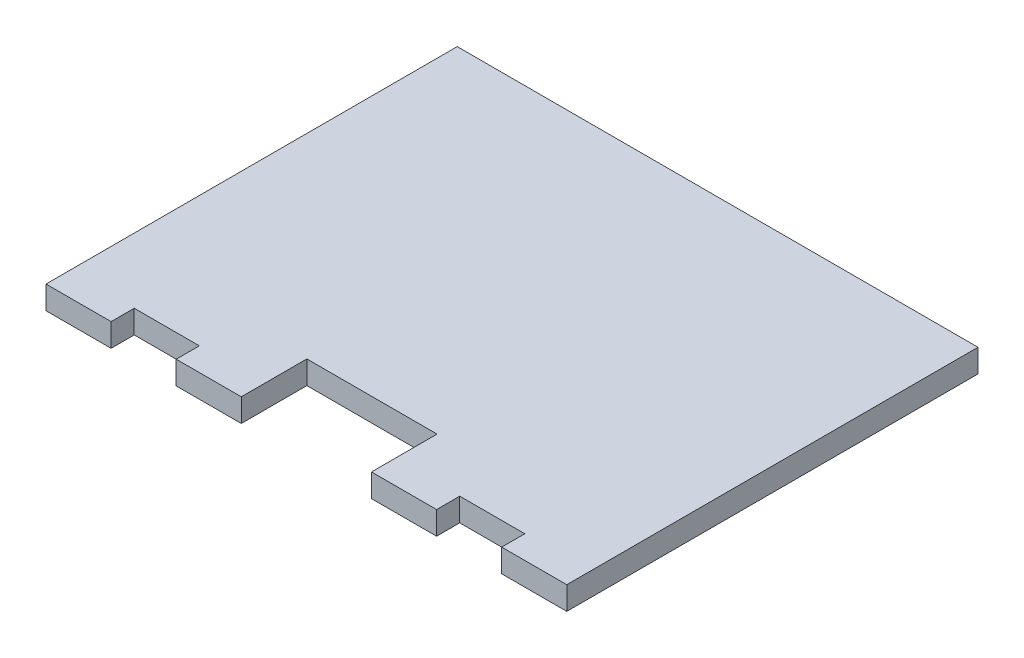
ISO-10303-21;
HEADER;
FILE_DESCRIPTION(('STEP AP214'),'2;1');
FILE_NAME('part.step','',(''),(''),'','','');
FILE_SCHEMA(('AUTOMOTIVE_DESIGN { 1 0 10303 214 1 1 1 1 }'));
ENDSEC;
DATA;
#1=APPLICATION_CONTEXT('core data for automotive mechanical design processes');
#2=APPLICATION_PROTOCOL_DEFINITION('international standard','automotive_design',2000,#1);
#3=PRODUCT_CONTEXT('',#1,'mechanical');
#4=PRODUCT('Part','Part','',(#3));
#5=PRODUCT_RELATED_PRODUCT_CATEGORY('part','',(#4));
#6=PRODUCT_DEFINITION_FORMATION('','',#4);
#7=PRODUCT_DEFINITION_CONTEXT('part definition',#1,'design');
#8=PRODUCT_DEFINITION('design','',#6,#7);
#9=PRODUCT_DEFINITION_SHAPE('','',#8);
#10=(LENGTH_UNIT() NAMED_UNIT(*) SI_UNIT(.MILLI.,.METRE.));
#11=(NAMED_UNIT(*) PLANE_ANGLE_UNIT() SI_UNIT($,.RADIAN.));
#12=(NAMED_UNIT(*) SI_UNIT($,.STERADIAN.) SOLID_ANGLE_UNIT());
#13=UNCERTAINTY_MEASURE_WITH_UNIT(LENGTH_MEASURE(1.E-05),#10,'distance_accuracy_value','');
#14=(GEOMETRIC_REPRESENTATION_CONTEXT(3) GLOBAL_UNCERTAINTY_ASSIGNED_CONTEXT((#13)) GLOBAL_UNIT_ASSIGNED_CONTEXT((#10,
#11,#12)) REPRESENTATION_CONTEXT('',''));
#15=CARTESIAN_POINT('',(0.,0.,0.));
#16=DIRECTION('',(0.,0.,1.));
#17=DIRECTION('',(1.,0.,0.));
#18=AXIS2_PLACEMENT_3D('',#15,#16,#17);
#19=CARTESIAN_POINT('',(-157.972676525822,11.43,159.925244882629));
#20=DIRECTION('',(0.,0.,-1.));
#21=DIRECTION('',(-1.,0.,0.));
#22=AXIS2_PLACEMENT_3D('',#19,#20,#21);
#23=PLANE('',#22);
#24=DIRECTION('',(0.,-1.,0.));
#25=VECTOR('',#24,1.);
#26=CARTESIAN_POINT('',(-93.6757515258217,11.43,159.925244882629));
#27=LINE('',#26,#25);
#28=CARTESIAN_POINT('',(-93.6757515258217,11.43,159.925244882629));
#29=VERTEX_POINT('',#28);
#30=CARTESIAN_POINT('',(-93.6757515258217,0.,159.925244882629));
#31=VERTEX_POINT('',#30);
#32=EDGE_CURVE('E146',#29,#31,#27,.T.);
#33=ORIENTED_EDGE('',*,*,#32,.T.);
#34=DIRECTION('',(1.,0.,0.));
#35=VECTOR('',#34,1.);
#36=CARTESIAN_POINT('',(-157.972676525822,0.,159.925244882629));
#37=LINE('',#36,#35);
#38=CARTESIAN_POINT('',(-61.5272890258217,0.,159.925244882629));
#39=VERTEX_POINT('',#38);
#40=EDGE_CURVE('E195',#31,#39,#37,.T.);
#41=ORIENTED_EDGE('',*,*,#40,.T.);
#42=DIRECTION('',(0.,-1.,0.));
#43=VECTOR('',#42,1.);
#44=CARTESIAN_POINT('',(-61.5272890258217,11.43,159.925244882629));
#45=LINE('',#44,#43);
#46=CARTESIAN_POINT('',(-61.5272890258217,11.43,159.925244882629));
#47=VERTEX_POINT('',#46);
#48=EDGE_CURVE('E55',#47,#39,#45,.T.);
#49=ORIENTED_EDGE('',*,*,#48,.F.);
#50=DIRECTION('',(1.,0.,0.));
#51=VECTOR('',#50,1.);
#52=CARTESIAN_POINT('',(-157.972676525822,11.43,159.925244882629));
#53=LINE('',#52,#51);
#54=EDGE_CURVE('E165',#29,#47,#53,.T.);
#55=ORIENTED_EDGE('',*,*,#54,.F.);
#56=EDGE_LOOP('',(#33,#41,#49,#55));
#57=FACE_BOUND('',#56,.T.);
#58=ADVANCED_FACE('F32',(#57),#23,.F.);
#59=DIRECTION('',(0.,-1.,0.));
#60=VECTOR('',#59,1.);
#61=CARTESIAN_POINT('',(2.76963597417831,11.43,159.925244882629));
#62=LINE('',#61,#60);
#63=CARTESIAN_POINT('',(2.76963597417831,11.43,159.925244882629));
#64=VERTEX_POINT('',#63);
#65=CARTESIAN_POINT('',(2.76963597417831,0.,159.925244882629));
#66=VERTEX_POINT('',#65);
#67=EDGE_CURVE('E260',#64,#66,#62,.T.);
#68=ORIENTED_EDGE('',*,*,#67,.T.);
#69=CARTESIAN_POINT('',(34.9180984741783,0.,159.925244882629));
#70=VERTEX_POINT('',#69);
#71=EDGE_CURVE('E363',#66,#70,#37,.T.);
#72=ORIENTED_EDGE('',*,*,#71,.T.);
#73=DIRECTION('',(0.,-1.,0.));
#74=VECTOR('',#73,1.);
#75=CARTESIAN_POINT('',(34.9180984741783,11.43,159.925244882629));
#76=LINE('',#75,#74);
#77=CARTESIAN_POINT('',(34.9180984741783,11.43,159.925244882629));
#78=VERTEX_POINT('',#77);
#79=EDGE_CURVE('E47',#78,#70,#76,.T.);
#80=ORIENTED_EDGE('',*,*,#79,.F.);
#81=EDGE_CURVE('E172',#64,#78,#53,.T.);
#82=ORIENTED_EDGE('',*,*,#81,.F.);
#83=EDGE_LOOP('',(#68,#72,#80,#82));
#84=FACE_BOUND('',#83,.T.);
#85=ADVANCED_FACE('F305',(#84),#23,.F.);
#86=DIRECTION('',(0.,-1.,0.));
#87=VECTOR('',#86,1.);
#88=CARTESIAN_POINT('',(67.0665609741783,11.43,159.925244882629));
#89=LINE('',#88,#87);
#90=CARTESIAN_POINT('',(67.0665609741783,11.43,159.925244882629));
#91=VERTEX_POINT('',#90);
#92=CARTESIAN_POINT('',(67.0665609741783,0.,159.925244882629));
#93=VERTEX_POINT('',#92);
#94=EDGE_CURVE('E231',#91,#93,#89,.T.);
#95=ORIENTED_EDGE('',*,*,#94,.T.);
#96=CARTESIAN_POINT('',(99.2150234741784,0.,159.925244882629));
#97=VERTEX_POINT('',#96);
#98=EDGE_CURVE('E189',#93,#97,#37,.T.);
#99=ORIENTED_EDGE('',*,*,#98,.T.);
#100=DIRECTION('',(0.,-1.,0.));
#101=VECTOR('',#100,1.);
#102=CARTESIAN_POINT('',(99.2150234741784,11.43,159.925244882629));
#103=LINE('',#102,#101);
#104=CARTESIAN_POINT('',(99.2150234741784,11.43,159.925244882629));
#105=VERTEX_POINT('',#104);
#106=EDGE_CURVE('E40',#105,#97,#103,.T.);
#107=ORIENTED_EDGE('',*,*,#106,.F.);
#108=EDGE_CURVE('E176',#91,#105,#53,.T.);
#109=ORIENTED_EDGE('',*,*,#108,.F.);
#110=EDGE_LOOP('',(#95,#99,#107,#109));
#111=FACE_BOUND('',#110,.T.);
#112=ADVANCED_FACE('F230',(#111),#23,.F.);
#113=CARTESIAN_POINT('',(0.,11.43,0.));
#114=DIRECTION('',(0.,1.,0.));
#115=DIRECTION('',(0.,0.,1.));
#116=AXIS2_PLACEMENT_3D('',#113,#114,#115);
#117=PLANE('',#116);
#118=DIRECTION('',(1.,0.,0.));
#119=VECTOR('',#118,1.);
#120=CARTESIAN_POINT('',(0.,11.43,148.495244882629));
#121=LINE('',#120,#119);
#122=CARTESIAN_POINT('',(-125.824214025822,11.43,148.495244882629));
#123=VERTEX_POINT('',#122);
#124=CARTESIAN_POINT('',(-93.6757515258217,11.43,148.495244882629));
#125=VERTEX_POINT('',#124);
#126=EDGE_CURVE('E158',#123,#125,#121,.T.);
#127=ORIENTED_EDGE('',*,*,#126,.T.);
#128=DIRECTION('',(0.,0.,-1.));
#129=VECTOR('',#128,1.);
#130=CARTESIAN_POINT('',(-93.6757515258217,11.43,0.));
#131=LINE('',#130,#129);
#132=EDGE_CURVE('E149',#29,#125,#131,.T.);
#133=ORIENTED_EDGE('',*,*,#132,.F.);
#134=ORIENTED_EDGE('',*,*,#54,.T.);
#135=DIRECTION('',(0.,0.,-1.));
#136=VECTOR('',#135,1.);
#137=CARTESIAN_POINT('',(-61.5272890258217,11.43,0.));
#138=LINE('',#137,#136);
#139=CARTESIAN_POINT('',(-61.5272890258217,11.43,127.540244882629));
#140=VERTEX_POINT('',#139);
#141=EDGE_CURVE('E266',#47,#140,#138,.T.);
#142=ORIENTED_EDGE('',*,*,#141,.T.);
#143=DIRECTION('',(-1.,0.,0.));
#144=VECTOR('',#143,1.);
#145=CARTESIAN_POINT('',(0.,11.43,127.540244882629));
#146=LINE('',#145,#144);
#147=CARTESIAN_POINT('',(2.76963597417831,11.43,127.540244882629));
#148=VERTEX_POINT('',#147);
#149=EDGE_CURVE('E272',#148,#140,#146,.T.);
#150=ORIENTED_EDGE('',*,*,#149,.F.);
#151=DIRECTION('',(0.,0.,-1.));
#152=VECTOR('',#151,1.);
#153=CARTESIAN_POINT('',(2.76963597417831,11.43,0.));
#154=LINE('',#153,#152);
#155=EDGE_CURVE('E256',#64,#148,#154,.T.);
#156=ORIENTED_EDGE('',*,*,#155,.F.);
#157=ORIENTED_EDGE('',*,*,#81,.T.);
#158=DIRECTION('',(0.,0.,-1.));
#159=VECTOR('',#158,1.);
#160=CARTESIAN_POINT('',(34.9180984741783,11.43,0.));
#161=LINE('',#160,#159);
#162=CARTESIAN_POINT('',(34.9180984741783,11.43,148.495244882629));
#163=VERTEX_POINT('',#162);
#164=EDGE_CURVE('E236',#78,#163,#161,.T.);
#165=ORIENTED_EDGE('',*,*,#164,.T.);
#166=DIRECTION('',(-1.,0.,0.));
#167=VECTOR('',#166,1.);
#168=CARTESIAN_POINT('',(0.,11.43,148.495244882629));
#169=LINE('',#168,#167);
#170=CARTESIAN_POINT('',(67.0665609741783,11.43,148.495244882629));
#171=VERTEX_POINT('',#170);
#172=EDGE_CURVE('E233',#171,#163,#169,.T.);
#173=ORIENTED_EDGE('',*,*,#172,.F.);
#174=DIRECTION('',(0.,0.,-1.));
#175=VECTOR('',#174,1.);
#176=CARTESIAN_POINT('',(67.0665609741787,11.43,1.62858355590464E-13));
#177=LINE('',#176,#175);
#178=EDGE_CURVE('E228',#91,#171,#177,.T.);
#179=ORIENTED_EDGE('',*,*,#178,.F.);
#180=ORIENTED_EDGE('',*,*,#108,.T.);
#181=DIRECTION('',(0.,0.,-1.));
#182=VECTOR('',#181,1.);
#183=CARTESIAN_POINT('',(99.2150234741784,11.43,-43.1680751173709));
#184=LINE('',#183,#182);
#185=CARTESIAN_POINT('',(99.2150234741784,11.43,-43.1680751173709));
#186=VERTEX_POINT('',#185);
#187=EDGE_CURVE('E175',#105,#186,#184,.T.);
#188=ORIENTED_EDGE('',*,*,#187,.T.);
#189=DIRECTION('',(-1.,0.,0.));
#190=VECTOR('',#189,1.);
#191=CARTESIAN_POINT('',(-157.972676525822,11.43,-43.1680751173709));
#192=LINE('',#191,#190);
#193=CARTESIAN_POINT('',(-157.972676525822,11.43,-43.1680751173709));
#194=VERTEX_POINT('',#193);
#195=EDGE_CURVE('E183',#186,#194,#192,.T.);
#196=ORIENTED_EDGE('',*,*,#195,.T.);
#197=DIRECTION('',(0.,0.,1.));
#198=VECTOR('',#197,1.);
#199=CARTESIAN_POINT('',(-157.972676525822,11.43,-43.1680751173709));
#200=LINE('',#199,#198);
#201=CARTESIAN_POINT('',(-157.972676525822,11.43,159.925244882629));
#202=VERTEX_POINT('',#201);
#203=EDGE_CURVE('E180',#194,#202,#200,.T.);
#204=ORIENTED_EDGE('',*,*,#203,.T.);
#205=CARTESIAN_POINT('',(-125.824214025822,11.43,159.925244882629));
#206=VERTEX_POINT('',#205);
#207=EDGE_CURVE('E171',#202,#206,#53,.T.);
#208=ORIENTED_EDGE('',*,*,#207,.T.);
#209=DIRECTION('',(0.,0.,-1.));
#210=VECTOR('',#209,1.);
#211=CARTESIAN_POINT('',(-125.824214025822,11.43,3.05540112569623E-13));
#212=LINE('',#211,#210);
#213=EDGE_CURVE('E168',#206,#123,#212,.T.);
#214=ORIENTED_EDGE('',*,*,#213,.T.);
#215=EDGE_LOOP('',(#127,#133,#134,#142,#150,#156,#157,#165,#173,#179,#180,#188,#196,#204,#208,#214));
#216=FACE_BOUND('',#215,.T.);
#217=ADVANCED_FACE('F163',(#216),#117,.T.);
#218=CARTESIAN_POINT('',(0.,0.,0.));
#219=DIRECTION('',(0.,1.,0.));
#220=DIRECTION('',(0.,0.,1.));
#221=AXIS2_PLACEMENT_3D('',#218,#219,#220);
#222=PLANE('',#221);
#223=DIRECTION('',(0.,0.,-1.));
#224=VECTOR('',#223,1.);
#225=CARTESIAN_POINT('',(-93.6757515258217,0.,0.));
#226=LINE('',#225,#224);
#227=CARTESIAN_POINT('',(-93.6757515258217,0.,148.495244882629));
#228=VERTEX_POINT('',#227);
#229=EDGE_CURVE('E152',#31,#228,#226,.T.);
#230=ORIENTED_EDGE('',*,*,#229,.T.);
#231=DIRECTION('',(1.,0.,0.));
#232=VECTOR('',#231,1.);
#233=CARTESIAN_POINT('',(0.,0.,148.495244882629));
#234=LINE('',#233,#232);
#235=CARTESIAN_POINT('',(-125.824214025822,0.,148.495244882629));
#236=VERTEX_POINT('',#235);
#237=EDGE_CURVE('E169',#236,#228,#234,.T.);
#238=ORIENTED_EDGE('',*,*,#237,.F.);
#239=DIRECTION('',(0.,0.,-1.));
#240=VECTOR('',#239,1.);
#241=CARTESIAN_POINT('',(-125.824214025822,0.,3.05540112569623E-13));
#242=LINE('',#241,#240);
#243=CARTESIAN_POINT('',(-125.824214025822,0.,159.925244882629));
#244=VERTEX_POINT('',#243);
#245=EDGE_CURVE('E281',#244,#236,#242,.T.);
#246=ORIENTED_EDGE('',*,*,#245,.F.);
#247=CARTESIAN_POINT('',(-157.972676525822,0.,159.925244882629));
#248=VERTEX_POINT('',#247);
#249=EDGE_CURVE('E191',#248,#244,#37,.T.);
#250=ORIENTED_EDGE('',*,*,#249,.F.);
#251=DIRECTION('',(0.,0.,1.));
#252=VECTOR('',#251,1.);
#253=CARTESIAN_POINT('',(-157.972676525822,0.,-43.1680751173709));
#254=LINE('',#253,#252);
#255=CARTESIAN_POINT('',(-157.972676525822,0.,-43.1680751173709));
#256=VERTEX_POINT('',#255);
#257=EDGE_CURVE('E186',#256,#248,#254,.T.);
#258=ORIENTED_EDGE('',*,*,#257,.F.);
#259=DIRECTION('',(-1.,0.,0.));
#260=VECTOR('',#259,1.);
#261=CARTESIAN_POINT('',(-157.972676525822,0.,-43.1680751173709));
#262=LINE('',#261,#260);
#263=CARTESIAN_POINT('',(99.2150234741784,0.,-43.1680751173709));
#264=VERTEX_POINT('',#263);
#265=EDGE_CURVE('E197',#264,#256,#262,.T.);
#266=ORIENTED_EDGE('',*,*,#265,.F.);
#267=DIRECTION('',(0.,0.,-1.));
#268=VECTOR('',#267,1.);
#269=CARTESIAN_POINT('',(99.2150234741784,0.,-43.1680751173709));
#270=LINE('',#269,#268);
#271=EDGE_CURVE('E194',#97,#264,#270,.T.);
#272=ORIENTED_EDGE('',*,*,#271,.F.);
#273=ORIENTED_EDGE('',*,*,#98,.F.);
#274=DIRECTION('',(0.,0.,-1.));
#275=VECTOR('',#274,1.);
#276=CARTESIAN_POINT('',(67.0665609741787,0.,1.62858355590464E-13));
#277=LINE('',#276,#275);
#278=CARTESIAN_POINT('',(67.0665609741783,0.,148.495244882629));
#279=VERTEX_POINT('',#278);
#280=EDGE_CURVE('E249',#93,#279,#277,.T.);
#281=ORIENTED_EDGE('',*,*,#280,.T.);
#282=DIRECTION('',(-1.,0.,0.));
#283=VECTOR('',#282,1.);
#284=CARTESIAN_POINT('',(0.,0.,148.495244882629));
#285=LINE('',#284,#283);
#286=CARTESIAN_POINT('',(34.9180984741783,0.,148.495244882629));
#287=VERTEX_POINT('',#286);
#288=EDGE_CURVE('E244',#279,#287,#285,.T.);
#289=ORIENTED_EDGE('',*,*,#288,.T.);
#290=DIRECTION('',(0.,0.,-1.));
#291=VECTOR('',#290,1.);
#292=CARTESIAN_POINT('',(34.9180984741783,0.,0.));
#293=LINE('',#292,#291);
#294=EDGE_CURVE('E247',#70,#287,#293,.T.);
#295=ORIENTED_EDGE('',*,*,#294,.F.);
#296=ORIENTED_EDGE('',*,*,#71,.F.);
#297=DIRECTION('',(0.,0.,-1.));
#298=VECTOR('',#297,1.);
#299=CARTESIAN_POINT('',(2.76963597417831,0.,0.));
#300=LINE('',#299,#298);
#301=CARTESIAN_POINT('',(2.76963597417831,0.,127.540244882629));
#302=VERTEX_POINT('',#301);
#303=EDGE_CURVE('E263',#66,#302,#300,.T.);
#304=ORIENTED_EDGE('',*,*,#303,.T.);
#305=DIRECTION('',(-1.,0.,0.));
#306=VECTOR('',#305,1.);
#307=CARTESIAN_POINT('',(0.,0.,127.540244882629));
#308=LINE('',#307,#306);
#309=CARTESIAN_POINT('',(-61.5272890258217,0.,127.540244882629));
#310=VERTEX_POINT('',#309);
#311=EDGE_CURVE('E267',#302,#310,#308,.T.);
#312=ORIENTED_EDGE('',*,*,#311,.T.);
#313=DIRECTION('',(0.,0.,-1.));
#314=VECTOR('',#313,1.);
#315=CARTESIAN_POINT('',(-61.5272890258217,0.,0.));
#316=LINE('',#315,#314);
#317=EDGE_CURVE('E243',#39,#310,#316,.T.);
#318=ORIENTED_EDGE('',*,*,#317,.F.);
#319=ORIENTED_EDGE('',*,*,#40,.F.);
#320=EDGE_LOOP('',(#230,#238,#246,#250,#258,#266,#272,#273,#281,#289,#295,#296,#304,#312,#318,#319));
#321=FACE_BOUND('',#320,.T.);
#322=ADVANCED_FACE('F215',(#321),#222,.F.);
#323=CARTESIAN_POINT('',(-157.972676525822,11.43,-43.1680751173709));
#324=DIRECTION('',(1.,0.,0.));
#325=DIRECTION('',(0.,0.,-1.));
#326=AXIS2_PLACEMENT_3D('',#323,#324,#325);
#327=PLANE('',#326);
#328=ORIENTED_EDGE('',*,*,#257,.T.);
#329=DIRECTION('',(0.,-1.,0.));
#330=VECTOR('',#329,1.);
#331=CARTESIAN_POINT('',(-157.972676525822,11.43,159.925244882629));
#332=LINE('',#331,#330);
#333=EDGE_CURVE('E11',#202,#248,#332,.T.);
#334=ORIENTED_EDGE('',*,*,#333,.F.);
#335=ORIENTED_EDGE('',*,*,#203,.F.);
#336=DIRECTION('',(0.,-1.,0.));
#337=VECTOR('',#336,1.);
#338=CARTESIAN_POINT('',(-157.972676525822,11.43,-43.1680751173709));
#339=LINE('',#338,#337);
#340=EDGE_CURVE('E185',#194,#256,#339,.T.);
#341=ORIENTED_EDGE('',*,*,#340,.T.);
#342=EDGE_LOOP('',(#328,#334,#335,#341));
#343=FACE_BOUND('',#342,.T.);
#344=ADVANCED_FACE('F34',(#343),#327,.F.);
#345=ORIENTED_EDGE('',*,*,#249,.T.);
#346=DIRECTION('',(0.,-1.,0.));
#347=VECTOR('',#346,1.);
#348=CARTESIAN_POINT('',(-125.824214025822,11.43,159.925244882629));
#349=LINE('',#348,#347);
#350=EDGE_CURVE('E157',#206,#244,#349,.T.);
#351=ORIENTED_EDGE('',*,*,#350,.F.);
#352=ORIENTED_EDGE('',*,*,#207,.F.);
#353=ORIENTED_EDGE('',*,*,#333,.T.);
#354=EDGE_LOOP('',(#345,#351,#352,#353));
#355=FACE_BOUND('',#354,.T.);
#356=ADVANCED_FACE('F291',(#355),#23,.F.);
#357=CARTESIAN_POINT('',(99.2150234741784,11.43,-43.1680751173709));
#358=DIRECTION('',(-1.,0.,0.));
#359=DIRECTION('',(0.,0.,1.));
#360=AXIS2_PLACEMENT_3D('',#357,#358,#359);
#361=PLANE('',#360);
#362=ORIENTED_EDGE('',*,*,#271,.T.);
#363=DIRECTION('',(0.,-1.,0.));
#364=VECTOR('',#363,1.);
#365=CARTESIAN_POINT('',(99.2150234741784,11.43,-43.1680751173709));
#366=LINE('',#365,#364);
#367=EDGE_CURVE('E201',#186,#264,#366,.T.);
#368=ORIENTED_EDGE('',*,*,#367,.F.);
#369=ORIENTED_EDGE('',*,*,#187,.F.);
#370=ORIENTED_EDGE('',*,*,#106,.T.);
#371=EDGE_LOOP('',(#362,#368,#369,#370));
#372=FACE_BOUND('',#371,.T.);
#373=ADVANCED_FACE('F208',(#372),#361,.F.);
#374=CARTESIAN_POINT('',(-157.972676525822,11.43,-43.1680751173709));
#375=DIRECTION('',(0.,0.,1.));
#376=DIRECTION('',(1.,0.,0.));
#377=AXIS2_PLACEMENT_3D('',#374,#375,#376);
#378=PLANE('',#377);
#379=ORIENTED_EDGE('',*,*,#265,.T.);
#380=ORIENTED_EDGE('',*,*,#340,.F.);
#381=ORIENTED_EDGE('',*,*,#195,.F.);
#382=ORIENTED_EDGE('',*,*,#367,.T.);
#383=EDGE_LOOP('',(#379,#380,#381,#382));
#384=FACE_BOUND('',#383,.T.);
#385=ADVANCED_FACE('F220',(#384),#378,.F.);
#386=CARTESIAN_POINT('',(67.0665609741787,11.43,1.62858355590464E-13));
#387=DIRECTION('',(-1.,0.,0.));
#388=DIRECTION('',(0.,0.,1.));
#389=AXIS2_PLACEMENT_3D('',#386,#387,#388);
#390=PLANE('',#389);
#391=ORIENTED_EDGE('',*,*,#280,.F.);
#392=ORIENTED_EDGE('',*,*,#94,.F.);
#393=ORIENTED_EDGE('',*,*,#178,.T.);
#394=DIRECTION('',(0.,-1.,0.));
#395=VECTOR('',#394,1.);
#396=CARTESIAN_POINT('',(67.0665609741783,11.43,148.495244882629));
#397=LINE('',#396,#395);
#398=EDGE_CURVE('E240',#171,#279,#397,.T.);
#399=ORIENTED_EDGE('',*,*,#398,.T.);
#400=EDGE_LOOP('',(#391,#392,#393,#399));
#401=FACE_BOUND('',#400,.T.);
#402=ADVANCED_FACE('F326',(#401),#390,.T.);
#403=CARTESIAN_POINT('',(0.,11.43,148.495244882629));
#404=DIRECTION('',(0.,0.,1.));
#405=DIRECTION('',(1.,0.,0.));
#406=AXIS2_PLACEMENT_3D('',#403,#404,#405);
#407=PLANE('',#406);
#408=ORIENTED_EDGE('',*,*,#288,.F.);
#409=ORIENTED_EDGE('',*,*,#398,.F.);
#410=ORIENTED_EDGE('',*,*,#172,.T.);
#411=DIRECTION('',(0.,-1.,0.));
#412=VECTOR('',#411,1.);
#413=CARTESIAN_POINT('',(34.9180984741783,11.43,148.495244882629));
#414=LINE('',#413,#412);
#415=EDGE_CURVE('E234',#163,#287,#414,.T.);
#416=ORIENTED_EDGE('',*,*,#415,.T.);
#417=EDGE_LOOP('',(#408,#409,#410,#416));
#418=FACE_BOUND('',#417,.T.);
#419=ADVANCED_FACE('F333',(#418),#407,.T.);
#420=CARTESIAN_POINT('',(34.9180984741783,11.43,0.));
#421=DIRECTION('',(-1.,0.,0.));
#422=DIRECTION('',(0.,0.,1.));
#423=AXIS2_PLACEMENT_3D('',#420,#421,#422);
#424=PLANE('',#423);
#425=ORIENTED_EDGE('',*,*,#294,.T.);
#426=ORIENTED_EDGE('',*,*,#415,.F.);
#427=ORIENTED_EDGE('',*,*,#164,.F.);
#428=ORIENTED_EDGE('',*,*,#79,.T.);
#429=EDGE_LOOP('',(#425,#426,#427,#428));
#430=FACE_BOUND('',#429,.T.);
#431=ADVANCED_FACE('F337',(#430),#424,.F.);
#432=CARTESIAN_POINT('',(2.76963597417831,11.43,0.));
#433=DIRECTION('',(-1.,0.,0.));
#434=DIRECTION('',(0.,0.,1.));
#435=AXIS2_PLACEMENT_3D('',#432,#433,#434);
#436=PLANE('',#435);
#437=ORIENTED_EDGE('',*,*,#303,.F.);
#438=ORIENTED_EDGE('',*,*,#67,.F.);
#439=ORIENTED_EDGE('',*,*,#155,.T.);
#440=DIRECTION('',(0.,-1.,0.));
#441=VECTOR('',#440,1.);
#442=CARTESIAN_POINT('',(2.76963597417831,11.43,127.540244882629));
#443=LINE('',#442,#441);
#444=EDGE_CURVE('E258',#148,#302,#443,.T.);
#445=ORIENTED_EDGE('',*,*,#444,.T.);
#446=EDGE_LOOP('',(#437,#438,#439,#445));
#447=FACE_BOUND('',#446,.T.);
#448=ADVANCED_FACE('F345',(#447),#436,.T.);
#449=CARTESIAN_POINT('',(0.,11.43,127.540244882629));
#450=DIRECTION('',(0.,0.,1.));
#451=DIRECTION('',(1.,0.,0.));
#452=AXIS2_PLACEMENT_3D('',#449,#450,#451);
#453=PLANE('',#452);
#454=ORIENTED_EDGE('',*,*,#311,.F.);
#455=ORIENTED_EDGE('',*,*,#444,.F.);
#456=ORIENTED_EDGE('',*,*,#149,.T.);
#457=DIRECTION('',(0.,-1.,0.));
#458=VECTOR('',#457,1.);
#459=CARTESIAN_POINT('',(-61.5272890258217,11.43,127.540244882629));
#460=LINE('',#459,#458);
#461=EDGE_CURVE('E255',#140,#310,#460,.T.);
#462=ORIENTED_EDGE('',*,*,#461,.T.);
#463=EDGE_LOOP('',(#454,#455,#456,#462));
#464=FACE_BOUND('',#463,.T.);
#465=ADVANCED_FACE('F349',(#464),#453,.T.);
#466=CARTESIAN_POINT('',(-61.5272890258217,11.43,0.));
#467=DIRECTION('',(-1.,0.,0.));
#468=DIRECTION('',(0.,0.,1.));
#469=AXIS2_PLACEMENT_3D('',#466,#467,#468);
#470=PLANE('',#469);
#471=ORIENTED_EDGE('',*,*,#317,.T.);
#472=ORIENTED_EDGE('',*,*,#461,.F.);
#473=ORIENTED_EDGE('',*,*,#141,.F.);
#474=ORIENTED_EDGE('',*,*,#48,.T.);
#475=EDGE_LOOP('',(#471,#472,#473,#474));
#476=FACE_BOUND('',#475,.T.);
#477=ADVANCED_FACE('F302',(#476),#470,.F.);
#478=CARTESIAN_POINT('',(-93.6757515258217,11.43,0.));
#479=DIRECTION('',(-1.,0.,0.));
#480=DIRECTION('',(0.,0.,1.));
#481=AXIS2_PLACEMENT_3D('',#478,#479,#480);
#482=PLANE('',#481);
#483=ORIENTED_EDGE('',*,*,#229,.F.);
#484=ORIENTED_EDGE('',*,*,#32,.F.);
#485=ORIENTED_EDGE('',*,*,#132,.T.);
#486=DIRECTION('',(0.,-1.,0.));
#487=VECTOR('',#486,1.);
#488=CARTESIAN_POINT('',(-93.6757515258217,11.43,148.495244882629));
#489=LINE('',#488,#487);
#490=EDGE_CURVE('E190',#125,#228,#489,.T.);
#491=ORIENTED_EDGE('',*,*,#490,.T.);
#492=EDGE_LOOP('',(#483,#484,#485,#491));
#493=FACE_BOUND('',#492,.T.);
#494=ADVANCED_FACE('F148',(#493),#482,.T.);
#495=CARTESIAN_POINT('',(0.,11.43,148.495244882629));
#496=DIRECTION('',(0.,0.,-1.));
#497=DIRECTION('',(-1.,0.,0.));
#498=AXIS2_PLACEMENT_3D('',#495,#496,#497);
#499=PLANE('',#498);
#500=ORIENTED_EDGE('',*,*,#237,.T.);
#501=ORIENTED_EDGE('',*,*,#490,.F.);
#502=ORIENTED_EDGE('',*,*,#126,.F.);
#503=DIRECTION('',(0.,-1.,0.));
#504=VECTOR('',#503,1.);
#505=CARTESIAN_POINT('',(-125.824214025822,11.43,148.495244882629));
#506=LINE('',#505,#504);
#507=EDGE_CURVE('E276',#123,#236,#506,.T.);
#508=ORIENTED_EDGE('',*,*,#507,.T.);
#509=EDGE_LOOP('',(#500,#501,#502,#508));
#510=FACE_BOUND('',#509,.T.);
#511=ADVANCED_FACE('F294',(#510),#499,.F.);
#512=CARTESIAN_POINT('',(-125.824214025822,11.43,3.05540112569623E-13));
#513=DIRECTION('',(-1.,0.,0.));
#514=DIRECTION('',(0.,0.,1.));
#515=AXIS2_PLACEMENT_3D('',#512,#513,#514);
#516=PLANE('',#515);
#517=ORIENTED_EDGE('',*,*,#245,.T.);
#518=ORIENTED_EDGE('',*,*,#507,.F.);
#519=ORIENTED_EDGE('',*,*,#213,.F.);
#520=ORIENTED_EDGE('',*,*,#350,.T.);
#521=EDGE_LOOP('',(#517,#518,#519,#520));
#522=FACE_BOUND('',#521,.T.);
#523=ADVANCED_FACE('F288',(#522),#516,.F.);
#524=CLOSED_SHELL('',(#58,#85,#112,#217,#322,#344,#356,#373,#385,#402,#419,#431,#448,#465,#477,
#494,#511,#523));
#525=MANIFOLD_SOLID_BREP('B2',#524);
#526=ADVANCED_BREP_SHAPE_REPRESENTATION('',(#18,#525),#14);
#527=SHAPE_DEFINITION_REPRESENTATION(#9,#526);
ENDSEC;
END-ISO-10303-21;
